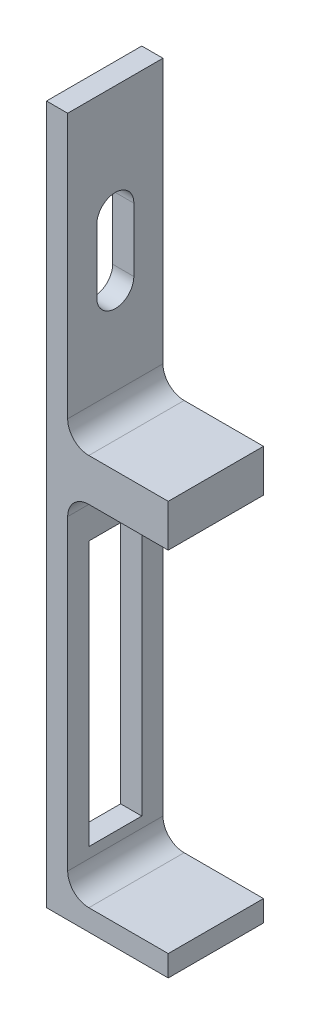
ISO-10303-21;
HEADER;
FILE_DESCRIPTION(('STEP AP214'),'2;1');
FILE_NAME('part.step','',(''),(''),'','','');
FILE_SCHEMA(('AUTOMOTIVE_DESIGN { 1 0 10303 214 1 1 1 1 }'));
ENDSEC;
DATA;
#1=APPLICATION_CONTEXT('core data for automotive mechanical design processes');
#2=APPLICATION_PROTOCOL_DEFINITION('international standard','automotive_design',2000,#1);
#3=PRODUCT_CONTEXT('',#1,'mechanical');
#4=PRODUCT('Part','Part','',(#3));
#5=PRODUCT_RELATED_PRODUCT_CATEGORY('part','',(#4));
#6=PRODUCT_DEFINITION_FORMATION('','',#4);
#7=PRODUCT_DEFINITION_CONTEXT('part definition',#1,'design');
#8=PRODUCT_DEFINITION('design','',#6,#7);
#9=PRODUCT_DEFINITION_SHAPE('','',#8);
#10=(LENGTH_UNIT() NAMED_UNIT(*) SI_UNIT(.MILLI.,.METRE.));
#11=(NAMED_UNIT(*) PLANE_ANGLE_UNIT() SI_UNIT($,.RADIAN.));
#12=(NAMED_UNIT(*) SI_UNIT($,.STERADIAN.) SOLID_ANGLE_UNIT());
#13=UNCERTAINTY_MEASURE_WITH_UNIT(LENGTH_MEASURE(1.E-05),#10,'distance_accuracy_value','');
#14=(GEOMETRIC_REPRESENTATION_CONTEXT(3) GLOBAL_UNCERTAINTY_ASSIGNED_CONTEXT((#13)) GLOBAL_UNIT_ASSIGNED_CONTEXT((#10,
#11,#12)) REPRESENTATION_CONTEXT('',''));
#15=CARTESIAN_POINT('',(0.,0.,0.));
#16=DIRECTION('',(0.,0.,1.));
#17=DIRECTION('',(1.,0.,0.));
#18=AXIS2_PLACEMENT_3D('',#15,#16,#17);
#19=CARTESIAN_POINT('',(2.,2.,9.));
#20=DIRECTION('',(-1.,0.,0.));
#21=DIRECTION('',(0.,0.,1.));
#22=AXIS2_PLACEMENT_3D('',#19,#20,#21);
#23=PLANE('',#22);
#24=DIRECTION('',(0.,1.,0.));
#25=VECTOR('',#24,1.);
#26=CARTESIAN_POINT('',(2.,2.,6.25000000000002));
#27=LINE('',#26,#25);
#28=CARTESIAN_POINT('',(2.,49.52,6.25000000000001));
#29=VERTEX_POINT('',#28);
#30=CARTESIAN_POINT('',(2.,55.52,6.25000000000001));
#31=VERTEX_POINT('',#30);
#32=EDGE_CURVE('E304',#29,#31,#27,.T.);
#33=ORIENTED_EDGE('',*,*,#32,.T.);
#34=CARTESIAN_POINT('',(2.,55.52,4.5));
#35=DIRECTION('',(-1.,0.,0.));
#36=DIRECTION('',(0.,0.,1.));
#37=AXIS2_PLACEMENT_3D('',#34,#35,#36);
#38=CIRCLE('',#37,1.75);
#39=CARTESIAN_POINT('',(2.,55.52,2.75));
#40=VERTEX_POINT('',#39);
#41=EDGE_CURVE('E307',#31,#40,#38,.T.);
#42=ORIENTED_EDGE('',*,*,#41,.T.);
#43=DIRECTION('',(0.,-1.,0.));
#44=VECTOR('',#43,1.);
#45=CARTESIAN_POINT('',(2.,2.,2.75000000000002));
#46=LINE('',#45,#44);
#47=CARTESIAN_POINT('',(2.,49.52,2.75));
#48=VERTEX_POINT('',#47);
#49=EDGE_CURVE('E298',#40,#48,#46,.T.);
#50=ORIENTED_EDGE('',*,*,#49,.T.);
#51=CARTESIAN_POINT('',(2.,49.52,4.50000000000001));
#52=DIRECTION('',(-1.,0.,0.));
#53=DIRECTION('',(0.,0.,1.));
#54=AXIS2_PLACEMENT_3D('',#51,#52,#53);
#55=CIRCLE('',#54,1.75);
#56=EDGE_CURVE('E301',#48,#29,#55,.T.);
#57=ORIENTED_EDGE('',*,*,#56,.T.);
#58=EDGE_LOOP('',(#33,#42,#50,#57));
#59=FACE_BOUND('',#58,.T.);
#60=DIRECTION('',(0.,1.,0.));
#61=VECTOR('',#60,1.);
#62=CARTESIAN_POINT('',(2.,2.,9.));
#63=LINE('',#62,#61);
#64=CARTESIAN_POINT('',(2.,41.,9.));
#65=VERTEX_POINT('',#64);
#66=CARTESIAN_POINT('',(2.,66.,9.));
#67=VERTEX_POINT('',#66);
#68=EDGE_CURVE('E264',#65,#67,#63,.T.);
#69=ORIENTED_EDGE('',*,*,#68,.F.);
#70=DIRECTION('',(0.,0.,1.));
#71=VECTOR('',#70,1.);
#72=CARTESIAN_POINT('',(2.,41.,9.));
#73=LINE('',#72,#71);
#74=CARTESIAN_POINT('',(2.,41.,0.));
#75=VERTEX_POINT('',#74);
#76=EDGE_CURVE('E322',#65,#75,#73,.F.);
#77=ORIENTED_EDGE('',*,*,#76,.T.);
#78=DIRECTION('',(0.,1.,0.));
#79=VECTOR('',#78,1.);
#80=CARTESIAN_POINT('',(2.,2.,0.));
#81=LINE('',#80,#79);
#82=CARTESIAN_POINT('',(2.,66.,0.));
#83=VERTEX_POINT('',#82);
#84=EDGE_CURVE('E279',#75,#83,#81,.T.);
#85=ORIENTED_EDGE('',*,*,#84,.T.);
#86=DIRECTION('',(0.,0.,-1.));
#87=VECTOR('',#86,1.);
#88=CARTESIAN_POINT('',(2.,66.,9.));
#89=LINE('',#88,#87);
#90=EDGE_CURVE('E286',#67,#83,#89,.T.);
#91=ORIENTED_EDGE('',*,*,#90,.F.);
#92=EDGE_LOOP('',(#69,#77,#85,#91));
#93=FACE_BOUND('',#92,.T.);
#94=ADVANCED_FACE('F36',(#59,#93),#23,.F.);
#95=CARTESIAN_POINT('',(0.,66.,9.));
#96=DIRECTION('',(1.,0.,0.));
#97=DIRECTION('',(0.,1.,0.));
#98=AXIS2_PLACEMENT_3D('',#95,#96,#97);
#99=PLANE('',#98);
#100=DIRECTION('',(0.,0.,1.));
#101=VECTOR('',#100,1.);
#102=CARTESIAN_POINT('',(0.,30.,7.));
#103=LINE('',#102,#101);
#104=CARTESIAN_POINT('',(0.,30.,2.00000000000001));
#105=VERTEX_POINT('',#104);
#106=CARTESIAN_POINT('',(0.,30.,7.));
#107=VERTEX_POINT('',#106);
#108=EDGE_CURVE('E210',#105,#107,#103,.T.);
#109=ORIENTED_EDGE('',*,*,#108,.T.);
#110=DIRECTION('',(0.,-1.,0.));
#111=VECTOR('',#110,1.);
#112=CARTESIAN_POINT('',(0.,5.,7.));
#113=LINE('',#112,#111);
#114=CARTESIAN_POINT('',(0.,5.,7.));
#115=VERTEX_POINT('',#114);
#116=EDGE_CURVE('E200',#107,#115,#113,.T.);
#117=ORIENTED_EDGE('',*,*,#116,.T.);
#118=DIRECTION('',(0.,0.,-1.));
#119=VECTOR('',#118,1.);
#120=CARTESIAN_POINT('',(0.,5.,7.));
#121=LINE('',#120,#119);
#122=CARTESIAN_POINT('',(0.,5.,2.00000000000001));
#123=VERTEX_POINT('',#122);
#124=EDGE_CURVE('E203',#115,#123,#121,.T.);
#125=ORIENTED_EDGE('',*,*,#124,.T.);
#126=DIRECTION('',(0.,1.,0.));
#127=VECTOR('',#126,1.);
#128=CARTESIAN_POINT('',(0.,5.,2.00000000000001));
#129=LINE('',#128,#127);
#130=EDGE_CURVE('E207',#123,#105,#129,.T.);
#131=ORIENTED_EDGE('',*,*,#130,.T.);
#132=EDGE_LOOP('',(#109,#117,#125,#131));
#133=FACE_BOUND('',#132,.T.);
#134=DIRECTION('',(0.,-1.,0.));
#135=VECTOR('',#134,1.);
#136=CARTESIAN_POINT('',(0.,55.52,2.75));
#137=LINE('',#136,#135);
#138=CARTESIAN_POINT('',(0.,55.52,2.75));
#139=VERTEX_POINT('',#138);
#140=CARTESIAN_POINT('',(0.,49.52,2.75));
#141=VERTEX_POINT('',#140);
#142=EDGE_CURVE('E235',#139,#141,#137,.T.);
#143=ORIENTED_EDGE('',*,*,#142,.F.);
#144=CARTESIAN_POINT('',(0.,55.52,4.5));
#145=DIRECTION('',(-1.,0.,0.));
#146=DIRECTION('',(0.,-1.,0.));
#147=AXIS2_PLACEMENT_3D('',#144,#145,#146);
#148=CIRCLE('',#147,1.75);
#149=CARTESIAN_POINT('',(0.,55.52,6.25000000000001));
#150=VERTEX_POINT('',#149);
#151=EDGE_CURVE('E227',#150,#139,#148,.T.);
#152=ORIENTED_EDGE('',*,*,#151,.F.);
#153=DIRECTION('',(0.,1.,0.));
#154=VECTOR('',#153,1.);
#155=CARTESIAN_POINT('',(0.,55.52,6.25000000000001));
#156=LINE('',#155,#154);
#157=CARTESIAN_POINT('',(0.,49.52,6.25000000000001));
#158=VERTEX_POINT('',#157);
#159=EDGE_CURVE('E241',#158,#150,#156,.T.);
#160=ORIENTED_EDGE('',*,*,#159,.F.);
#161=CARTESIAN_POINT('',(0.,49.52,4.50000000000001));
#162=DIRECTION('',(-1.,0.,0.));
#163=DIRECTION('',(0.,-1.,0.));
#164=AXIS2_PLACEMENT_3D('',#161,#162,#163);
#165=CIRCLE('',#164,1.75);
#166=EDGE_CURVE('E238',#141,#158,#165,.T.);
#167=ORIENTED_EDGE('',*,*,#166,.F.);
#168=EDGE_LOOP('',(#143,#152,#160,#167));
#169=FACE_BOUND('',#168,.T.);
#170=DIRECTION('',(0.,-1.,0.));
#171=VECTOR('',#170,1.);
#172=CARTESIAN_POINT('',(0.,66.,0.));
#173=LINE('',#172,#171);
#174=CARTESIAN_POINT('',(0.,66.,0.));
#175=VERTEX_POINT('',#174);
#176=CARTESIAN_POINT('',(0.,0.,0.));
#177=VERTEX_POINT('',#176);
#178=EDGE_CURVE('E247',#175,#177,#173,.T.);
#179=ORIENTED_EDGE('',*,*,#178,.T.);
#180=DIRECTION('',(0.,0.,-1.));
#181=VECTOR('',#180,1.);
#182=CARTESIAN_POINT('',(0.,0.,9.));
#183=LINE('',#182,#181);
#184=CARTESIAN_POINT('',(0.,0.,9.));
#185=VERTEX_POINT('',#184);
#186=EDGE_CURVE('E295',#185,#177,#183,.T.);
#187=ORIENTED_EDGE('',*,*,#186,.F.);
#188=DIRECTION('',(0.,-1.,0.));
#189=VECTOR('',#188,1.);
#190=CARTESIAN_POINT('',(0.,66.,9.));
#191=LINE('',#190,#189);
#192=CARTESIAN_POINT('',(0.,66.,9.));
#193=VERTEX_POINT('',#192);
#194=EDGE_CURVE('E254',#193,#185,#191,.T.);
#195=ORIENTED_EDGE('',*,*,#194,.F.);
#196=DIRECTION('',(0.,0.,-1.));
#197=VECTOR('',#196,1.);
#198=CARTESIAN_POINT('',(0.,66.,9.));
#199=LINE('',#198,#197);
#200=EDGE_CURVE('E269',#193,#175,#199,.T.);
#201=ORIENTED_EDGE('',*,*,#200,.T.);
#202=EDGE_LOOP('',(#179,#187,#195,#201));
#203=FACE_BOUND('',#202,.T.);
#204=ADVANCED_FACE('F357',(#133,#169,#203),#99,.F.);
#205=CARTESIAN_POINT('',(0.,0.,9.));
#206=DIRECTION('',(0.,1.,0.));
#207=DIRECTION('',(0.,0.,1.));
#208=AXIS2_PLACEMENT_3D('',#205,#206,#207);
#209=PLANE('',#208);
#210=DIRECTION('',(1.,0.,0.));
#211=VECTOR('',#210,1.);
#212=CARTESIAN_POINT('',(0.,0.,0.));
#213=LINE('',#212,#211);
#214=CARTESIAN_POINT('',(11.5,0.,0.));
#215=VERTEX_POINT('',#214);
#216=EDGE_CURVE('E272',#177,#215,#213,.T.);
#217=ORIENTED_EDGE('',*,*,#216,.T.);
#218=DIRECTION('',(0.,0.,-1.));
#219=VECTOR('',#218,1.);
#220=CARTESIAN_POINT('',(11.5,0.,9.));
#221=LINE('',#220,#219);
#222=CARTESIAN_POINT('',(11.5,0.,9.));
#223=VERTEX_POINT('',#222);
#224=EDGE_CURVE('E292',#223,#215,#221,.T.);
#225=ORIENTED_EDGE('',*,*,#224,.F.);
#226=DIRECTION('',(1.,0.,0.));
#227=VECTOR('',#226,1.);
#228=CARTESIAN_POINT('',(0.,0.,9.));
#229=LINE('',#228,#227);
#230=EDGE_CURVE('E256',#185,#223,#229,.T.);
#231=ORIENTED_EDGE('',*,*,#230,.F.);
#232=ORIENTED_EDGE('',*,*,#186,.T.);
#233=EDGE_LOOP('',(#217,#225,#231,#232));
#234=FACE_BOUND('',#233,.T.);
#235=ADVANCED_FACE('F359',(#234),#209,.F.);
#236=CARTESIAN_POINT('',(11.5,0.,9.));
#237=DIRECTION('',(-1.,0.,0.));
#238=DIRECTION('',(0.,0.,1.));
#239=AXIS2_PLACEMENT_3D('',#236,#237,#238);
#240=PLANE('',#239);
#241=DIRECTION('',(0.,1.,0.));
#242=VECTOR('',#241,1.);
#243=CARTESIAN_POINT('',(11.5,0.,0.));
#244=LINE('',#243,#242);
#245=CARTESIAN_POINT('',(11.5,2.,0.));
#246=VERTEX_POINT('',#245);
#247=EDGE_CURVE('E274',#215,#246,#244,.T.);
#248=ORIENTED_EDGE('',*,*,#247,.T.);
#249=DIRECTION('',(0.,0.,-1.));
#250=VECTOR('',#249,1.);
#251=CARTESIAN_POINT('',(11.5,2.,9.));
#252=LINE('',#251,#250);
#253=CARTESIAN_POINT('',(11.5,2.,9.));
#254=VERTEX_POINT('',#253);
#255=EDGE_CURVE('E289',#254,#246,#252,.T.);
#256=ORIENTED_EDGE('',*,*,#255,.F.);
#257=DIRECTION('',(0.,1.,0.));
#258=VECTOR('',#257,1.);
#259=CARTESIAN_POINT('',(11.5,0.,9.));
#260=LINE('',#259,#258);
#261=EDGE_CURVE('E259',#223,#254,#260,.T.);
#262=ORIENTED_EDGE('',*,*,#261,.F.);
#263=ORIENTED_EDGE('',*,*,#224,.T.);
#264=EDGE_LOOP('',(#248,#256,#262,#263));
#265=FACE_BOUND('',#264,.T.);
#266=ADVANCED_FACE('F364',(#265),#240,.F.);
#267=CARTESIAN_POINT('',(11.5,2.,9.));
#268=DIRECTION('',(0.,-1.,0.));
#269=DIRECTION('',(1.,0.,0.));
#270=AXIS2_PLACEMENT_3D('',#267,#268,#269);
#271=PLANE('',#270);
#272=DIRECTION('',(-1.,0.,0.));
#273=VECTOR('',#272,1.);
#274=CARTESIAN_POINT('',(11.5,2.,0.));
#275=LINE('',#274,#273);
#276=CARTESIAN_POINT('',(4.,2.,0.));
#277=VERTEX_POINT('',#276);
#278=EDGE_CURVE('E276',#246,#277,#275,.T.);
#279=ORIENTED_EDGE('',*,*,#278,.T.);
#280=DIRECTION('',(0.,0.,-1.));
#281=VECTOR('',#280,1.);
#282=CARTESIAN_POINT('',(4.,2.,9.));
#283=LINE('',#282,#281);
#284=CARTESIAN_POINT('',(4.,2.,9.));
#285=VERTEX_POINT('',#284);
#286=EDGE_CURVE('E313',#277,#285,#283,.F.);
#287=ORIENTED_EDGE('',*,*,#286,.T.);
#288=DIRECTION('',(-1.,0.,0.));
#289=VECTOR('',#288,1.);
#290=CARTESIAN_POINT('',(11.5,2.,9.));
#291=LINE('',#290,#289);
#292=EDGE_CURVE('E261',#254,#285,#291,.T.);
#293=ORIENTED_EDGE('',*,*,#292,.F.);
#294=ORIENTED_EDGE('',*,*,#255,.T.);
#295=EDGE_LOOP('',(#279,#287,#293,#294));
#296=FACE_BOUND('',#295,.T.);
#297=ADVANCED_FACE('F395',(#296),#271,.F.);
#298=DIRECTION('',(0.,0.,-1.));
#299=VECTOR('',#298,1.);
#300=CARTESIAN_POINT('',(2.,5.,7.));
#301=LINE('',#300,#299);
#302=CARTESIAN_POINT('',(2.,5.,7.));
#303=VERTEX_POINT('',#302);
#304=CARTESIAN_POINT('',(2.,5.,2.00000000000001));
#305=VERTEX_POINT('',#304);
#306=EDGE_CURVE('E216',#303,#305,#301,.T.);
#307=ORIENTED_EDGE('',*,*,#306,.F.);
#308=DIRECTION('',(0.,-1.,0.));
#309=VECTOR('',#308,1.);
#310=CARTESIAN_POINT('',(2.,5.,7.));
#311=LINE('',#310,#309);
#312=CARTESIAN_POINT('',(2.,30.,7.));
#313=VERTEX_POINT('',#312);
#314=EDGE_CURVE('E214',#313,#303,#311,.T.);
#315=ORIENTED_EDGE('',*,*,#314,.F.);
#316=DIRECTION('',(0.,0.,1.));
#317=VECTOR('',#316,1.);
#318=CARTESIAN_POINT('',(2.,30.,7.));
#319=LINE('',#318,#317);
#320=CARTESIAN_POINT('',(2.,30.,2.00000000000001));
#321=VERTEX_POINT('',#320);
#322=EDGE_CURVE('E204',#321,#313,#319,.T.);
#323=ORIENTED_EDGE('',*,*,#322,.F.);
#324=DIRECTION('',(0.,1.,0.));
#325=VECTOR('',#324,1.);
#326=CARTESIAN_POINT('',(2.,5.,2.00000000000001));
#327=LINE('',#326,#325);
#328=EDGE_CURVE('E220',#305,#321,#327,.T.);
#329=ORIENTED_EDGE('',*,*,#328,.F.);
#330=EDGE_LOOP('',(#307,#315,#323,#329));
#331=FACE_BOUND('',#330,.T.);
#332=CARTESIAN_POINT('',(2.,4.,0.));
#333=VERTEX_POINT('',#332);
#334=CARTESIAN_POINT('',(2.,33.,0.));
#335=VERTEX_POINT('',#334);
#336=EDGE_CURVE('E280',#333,#335,#81,.T.);
#337=ORIENTED_EDGE('',*,*,#336,.T.);
#338=DIRECTION('',(0.,0.,1.));
#339=VECTOR('',#338,1.);
#340=CARTESIAN_POINT('',(2.,33.,9.));
#341=LINE('',#340,#339);
#342=CARTESIAN_POINT('',(2.,33.,9.));
#343=VERTEX_POINT('',#342);
#344=EDGE_CURVE('E324',#335,#343,#341,.T.);
#345=ORIENTED_EDGE('',*,*,#344,.T.);
#346=CARTESIAN_POINT('',(2.,4.,9.));
#347=VERTEX_POINT('',#346);
#348=EDGE_CURVE('E265',#347,#343,#63,.T.);
#349=ORIENTED_EDGE('',*,*,#348,.F.);
#350=DIRECTION('',(0.,0.,-1.));
#351=VECTOR('',#350,1.);
#352=CARTESIAN_POINT('',(2.,4.,0.));
#353=LINE('',#352,#351);
#354=EDGE_CURVE('E310',#347,#333,#353,.T.);
#355=ORIENTED_EDGE('',*,*,#354,.T.);
#356=EDGE_LOOP('',(#337,#345,#349,#355));
#357=FACE_BOUND('',#356,.T.);
#358=ADVANCED_FACE('F375',(#331,#357),#23,.F.);
#359=CARTESIAN_POINT('',(2.,66.,9.));
#360=DIRECTION('',(0.,-1.,0.));
#361=DIRECTION('',(0.,0.,-1.));
#362=AXIS2_PLACEMENT_3D('',#359,#360,#361);
#363=PLANE('',#362);
#364=DIRECTION('',(-1.,0.,0.));
#365=VECTOR('',#364,1.);
#366=CARTESIAN_POINT('',(2.,66.,0.));
#367=LINE('',#366,#365);
#368=EDGE_CURVE('E257',#83,#175,#367,.T.);
#369=ORIENTED_EDGE('',*,*,#368,.T.);
#370=ORIENTED_EDGE('',*,*,#200,.F.);
#371=DIRECTION('',(-1.,0.,0.));
#372=VECTOR('',#371,1.);
#373=CARTESIAN_POINT('',(2.,66.,9.));
#374=LINE('',#373,#372);
#375=EDGE_CURVE('E267',#67,#193,#374,.T.);
#376=ORIENTED_EDGE('',*,*,#375,.F.);
#377=ORIENTED_EDGE('',*,*,#90,.T.);
#378=EDGE_LOOP('',(#369,#370,#376,#377));
#379=FACE_BOUND('',#378,.T.);
#380=ADVANCED_FACE('F352',(#379),#363,.F.);
#381=CARTESIAN_POINT('',(0.,0.,9.));
#382=DIRECTION('',(0.,0.,1.));
#383=DIRECTION('',(1.,0.,0.));
#384=AXIS2_PLACEMENT_3D('',#381,#382,#383);
#385=PLANE('',#384);
#386=ORIENTED_EDGE('',*,*,#194,.T.);
#387=ORIENTED_EDGE('',*,*,#230,.T.);
#388=ORIENTED_EDGE('',*,*,#261,.T.);
#389=ORIENTED_EDGE('',*,*,#292,.T.);
#390=CARTESIAN_POINT('',(4.,4.,9.));
#391=DIRECTION('',(0.,0.,1.));
#392=DIRECTION('',(1.,0.,0.));
#393=AXIS2_PLACEMENT_3D('',#390,#391,#392);
#394=CIRCLE('',#393,2.);
#395=EDGE_CURVE('E317',#285,#347,#394,.F.);
#396=ORIENTED_EDGE('',*,*,#395,.T.);
#397=ORIENTED_EDGE('',*,*,#348,.T.);
#398=CARTESIAN_POINT('',(4.,33.,9.));
#399=DIRECTION('',(0.,0.,1.));
#400=DIRECTION('',(1.,0.,0.));
#401=AXIS2_PLACEMENT_3D('',#398,#399,#400);
#402=CIRCLE('',#401,2.);
#403=CARTESIAN_POINT('',(4.,35.,9.));
#404=VERTEX_POINT('',#403);
#405=EDGE_CURVE('E44',#343,#404,#402,.F.);
#406=ORIENTED_EDGE('',*,*,#405,.T.);
#407=DIRECTION('',(1.,0.,0.));
#408=VECTOR('',#407,1.);
#409=CARTESIAN_POINT('',(2.,35.,9.));
#410=LINE('',#409,#408);
#411=CARTESIAN_POINT('',(11.5,35.,9.));
#412=VERTEX_POINT('',#411);
#413=EDGE_CURVE('E176',#404,#412,#410,.T.);
#414=ORIENTED_EDGE('',*,*,#413,.T.);
#415=DIRECTION('',(0.,1.,0.));
#416=VECTOR('',#415,1.);
#417=CARTESIAN_POINT('',(11.5,39.,9.));
#418=LINE('',#417,#416);
#419=CARTESIAN_POINT('',(11.5,39.,9.));
#420=VERTEX_POINT('',#419);
#421=EDGE_CURVE('E182',#412,#420,#418,.T.);
#422=ORIENTED_EDGE('',*,*,#421,.T.);
#423=DIRECTION('',(-1.,0.,0.));
#424=VECTOR('',#423,1.);
#425=CARTESIAN_POINT('',(2.,39.,9.));
#426=LINE('',#425,#424);
#427=CARTESIAN_POINT('',(4.,39.,9.));
#428=VERTEX_POINT('',#427);
#429=EDGE_CURVE('E183',#420,#428,#426,.T.);
#430=ORIENTED_EDGE('',*,*,#429,.T.);
#431=CARTESIAN_POINT('',(4.,41.,9.));
#432=DIRECTION('',(0.,0.,1.));
#433=DIRECTION('',(1.,0.,0.));
#434=AXIS2_PLACEMENT_3D('',#431,#432,#433);
#435=CIRCLE('',#434,2.);
#436=EDGE_CURVE('E328',#428,#65,#435,.F.);
#437=ORIENTED_EDGE('',*,*,#436,.T.);
#438=ORIENTED_EDGE('',*,*,#68,.T.);
#439=ORIENTED_EDGE('',*,*,#375,.T.);
#440=EDGE_LOOP('',(#386,#387,#388,#389,#396,#397,#406,#414,#422,#430,#437,#438,#439));
#441=FACE_BOUND('',#440,.T.);
#442=ADVANCED_FACE('F179',(#441),#385,.T.);
#443=CARTESIAN_POINT('',(0.,0.,0.));
#444=DIRECTION('',(0.,0.,1.));
#445=DIRECTION('',(1.,0.,0.));
#446=AXIS2_PLACEMENT_3D('',#443,#444,#445);
#447=PLANE('',#446);
#448=ORIENTED_EDGE('',*,*,#178,.F.);
#449=ORIENTED_EDGE('',*,*,#368,.F.);
#450=ORIENTED_EDGE('',*,*,#84,.F.);
#451=CARTESIAN_POINT('',(4.,41.,0.));
#452=DIRECTION('',(0.,0.,1.));
#453=DIRECTION('',(1.,0.,0.));
#454=AXIS2_PLACEMENT_3D('',#451,#452,#453);
#455=CIRCLE('',#454,2.);
#456=CARTESIAN_POINT('',(4.,39.,0.));
#457=VERTEX_POINT('',#456);
#458=EDGE_CURVE('E330',#75,#457,#455,.T.);
#459=ORIENTED_EDGE('',*,*,#458,.T.);
#460=DIRECTION('',(1.,0.,0.));
#461=VECTOR('',#460,1.);
#462=CARTESIAN_POINT('',(2.,39.,0.));
#463=LINE('',#462,#461);
#464=CARTESIAN_POINT('',(11.5,39.,0.));
#465=VERTEX_POINT('',#464);
#466=EDGE_CURVE('E217',#457,#465,#463,.T.);
#467=ORIENTED_EDGE('',*,*,#466,.T.);
#468=DIRECTION('',(0.,-1.,0.));
#469=VECTOR('',#468,1.);
#470=CARTESIAN_POINT('',(11.5,39.,0.));
#471=LINE('',#470,#469);
#472=CARTESIAN_POINT('',(11.5,35.,0.));
#473=VERTEX_POINT('',#472);
#474=EDGE_CURVE('E343',#465,#473,#471,.T.);
#475=ORIENTED_EDGE('',*,*,#474,.T.);
#476=DIRECTION('',(-1.,0.,0.));
#477=VECTOR('',#476,1.);
#478=CARTESIAN_POINT('',(2.,35.,0.));
#479=LINE('',#478,#477);
#480=CARTESIAN_POINT('',(4.,35.,0.));
#481=VERTEX_POINT('',#480);
#482=EDGE_CURVE('E188',#473,#481,#479,.T.);
#483=ORIENTED_EDGE('',*,*,#482,.T.);
#484=CARTESIAN_POINT('',(4.,33.,0.));
#485=DIRECTION('',(0.,0.,1.));
#486=DIRECTION('',(1.,0.,0.));
#487=AXIS2_PLACEMENT_3D('',#484,#485,#486);
#488=CIRCLE('',#487,2.);
#489=EDGE_CURVE('E11',#481,#335,#488,.T.);
#490=ORIENTED_EDGE('',*,*,#489,.T.);
#491=ORIENTED_EDGE('',*,*,#336,.F.);
#492=CARTESIAN_POINT('',(4.,4.,0.));
#493=DIRECTION('',(0.,0.,1.));
#494=DIRECTION('',(1.,0.,0.));
#495=AXIS2_PLACEMENT_3D('',#492,#493,#494);
#496=CIRCLE('',#495,2.);
#497=EDGE_CURVE('E315',#333,#277,#496,.T.);
#498=ORIENTED_EDGE('',*,*,#497,.T.);
#499=ORIENTED_EDGE('',*,*,#278,.F.);
#500=ORIENTED_EDGE('',*,*,#247,.F.);
#501=ORIENTED_EDGE('',*,*,#216,.F.);
#502=EDGE_LOOP('',(#448,#449,#450,#459,#467,#475,#483,#490,#491,#498,#499,#500,#501));
#503=FACE_BOUND('',#502,.T.);
#504=ADVANCED_FACE('F336',(#503),#447,.F.);
#505=CARTESIAN_POINT('',(11.5,55.52,4.5));
#506=DIRECTION('',(-1.,0.,0.));
#507=DIRECTION('',(0.,-1.,0.));
#508=AXIS2_PLACEMENT_3D('',#505,#506,#507);
#509=CYLINDRICAL_SURFACE('',#508,1.75);
#510=DIRECTION('',(-1.,0.,0.));
#511=VECTOR('',#510,1.);
#512=CARTESIAN_POINT('',(11.5,55.52,6.25000000000001));
#513=LINE('',#512,#511);
#514=EDGE_CURVE('E245',#31,#150,#513,.T.);
#515=ORIENTED_EDGE('',*,*,#514,.T.);
#516=ORIENTED_EDGE('',*,*,#151,.T.);
#517=DIRECTION('',(-1.,0.,0.));
#518=VECTOR('',#517,1.);
#519=CARTESIAN_POINT('',(11.5,55.52,2.75));
#520=LINE('',#519,#518);
#521=EDGE_CURVE('E244',#40,#139,#520,.T.);
#522=ORIENTED_EDGE('',*,*,#521,.F.);
#523=ORIENTED_EDGE('',*,*,#41,.F.);
#524=EDGE_LOOP('',(#515,#516,#522,#523));
#525=FACE_BOUND('',#524,.T.);
#526=ADVANCED_FACE('F427',(#525),#509,.F.);
#527=CARTESIAN_POINT('',(11.5,55.52,6.25000000000001));
#528=DIRECTION('',(0.,0.,1.));
#529=DIRECTION('',(0.,-1.,0.));
#530=AXIS2_PLACEMENT_3D('',#527,#528,#529);
#531=PLANE('',#530);
#532=DIRECTION('',(-1.,0.,0.));
#533=VECTOR('',#532,1.);
#534=CARTESIAN_POINT('',(11.5,49.52,6.25000000000001));
#535=LINE('',#534,#533);
#536=EDGE_CURVE('E248',#29,#158,#535,.T.);
#537=ORIENTED_EDGE('',*,*,#536,.T.);
#538=ORIENTED_EDGE('',*,*,#159,.T.);
#539=ORIENTED_EDGE('',*,*,#514,.F.);
#540=ORIENTED_EDGE('',*,*,#32,.F.);
#541=EDGE_LOOP('',(#537,#538,#539,#540));
#542=FACE_BOUND('',#541,.T.);
#543=ADVANCED_FACE('F431',(#542),#531,.F.);
#544=CARTESIAN_POINT('',(11.5,49.52,4.50000000000001));
#545=DIRECTION('',(-1.,0.,0.));
#546=DIRECTION('',(0.,-1.,0.));
#547=AXIS2_PLACEMENT_3D('',#544,#545,#546);
#548=CYLINDRICAL_SURFACE('',#547,1.75);
#549=DIRECTION('',(-1.,0.,0.));
#550=VECTOR('',#549,1.);
#551=CARTESIAN_POINT('',(11.5,49.52,2.75));
#552=LINE('',#551,#550);
#553=EDGE_CURVE('E250',#48,#141,#552,.T.);
#554=ORIENTED_EDGE('',*,*,#553,.T.);
#555=ORIENTED_EDGE('',*,*,#166,.T.);
#556=ORIENTED_EDGE('',*,*,#536,.F.);
#557=ORIENTED_EDGE('',*,*,#56,.F.);
#558=EDGE_LOOP('',(#554,#555,#556,#557));
#559=FACE_BOUND('',#558,.T.);
#560=ADVANCED_FACE('F433',(#559),#548,.F.);
#561=CARTESIAN_POINT('',(11.5,55.52,2.75));
#562=DIRECTION('',(0.,0.,-1.));
#563=DIRECTION('',(0.,1.,0.));
#564=AXIS2_PLACEMENT_3D('',#561,#562,#563);
#565=PLANE('',#564);
#566=ORIENTED_EDGE('',*,*,#521,.T.);
#567=ORIENTED_EDGE('',*,*,#142,.T.);
#568=ORIENTED_EDGE('',*,*,#553,.F.);
#569=ORIENTED_EDGE('',*,*,#49,.F.);
#570=EDGE_LOOP('',(#566,#567,#568,#569));
#571=FACE_BOUND('',#570,.T.);
#572=ADVANCED_FACE('F423',(#571),#565,.F.);
#573=CARTESIAN_POINT('',(0.,5.,7.));
#574=DIRECTION('',(0.,0.,1.));
#575=DIRECTION('',(0.,-1.,0.));
#576=AXIS2_PLACEMENT_3D('',#573,#574,#575);
#577=PLANE('',#576);
#578=ORIENTED_EDGE('',*,*,#314,.T.);
#579=DIRECTION('',(1.,0.,0.));
#580=VECTOR('',#579,1.);
#581=CARTESIAN_POINT('',(0.,5.,7.));
#582=LINE('',#581,#580);
#583=EDGE_CURVE('E213',#115,#303,#582,.T.);
#584=ORIENTED_EDGE('',*,*,#583,.F.);
#585=ORIENTED_EDGE('',*,*,#116,.F.);
#586=DIRECTION('',(1.,0.,0.));
#587=VECTOR('',#586,1.);
#588=CARTESIAN_POINT('',(0.,30.,7.));
#589=LINE('',#588,#587);
#590=EDGE_CURVE('E225',#107,#313,#589,.T.);
#591=ORIENTED_EDGE('',*,*,#590,.T.);
#592=EDGE_LOOP('',(#578,#584,#585,#591));
#593=FACE_BOUND('',#592,.T.);
#594=ADVANCED_FACE('F411',(#593),#577,.F.);
#595=CARTESIAN_POINT('',(0.,30.,7.));
#596=DIRECTION('',(0.,1.,0.));
#597=DIRECTION('',(0.,0.,1.));
#598=AXIS2_PLACEMENT_3D('',#595,#596,#597);
#599=PLANE('',#598);
#600=ORIENTED_EDGE('',*,*,#322,.T.);
#601=ORIENTED_EDGE('',*,*,#590,.F.);
#602=ORIENTED_EDGE('',*,*,#108,.F.);
#603=DIRECTION('',(1.,0.,0.));
#604=VECTOR('',#603,1.);
#605=CARTESIAN_POINT('',(0.,30.,2.00000000000001));
#606=LINE('',#605,#604);
#607=EDGE_CURVE('E228',#105,#321,#606,.T.);
#608=ORIENTED_EDGE('',*,*,#607,.T.);
#609=EDGE_LOOP('',(#600,#601,#602,#608));
#610=FACE_BOUND('',#609,.T.);
#611=ADVANCED_FACE('F414',(#610),#599,.F.);
#612=CARTESIAN_POINT('',(0.,5.,2.00000000000001));
#613=DIRECTION('',(0.,0.,-1.));
#614=DIRECTION('',(0.,1.,0.));
#615=AXIS2_PLACEMENT_3D('',#612,#613,#614);
#616=PLANE('',#615);
#617=ORIENTED_EDGE('',*,*,#328,.T.);
#618=ORIENTED_EDGE('',*,*,#607,.F.);
#619=ORIENTED_EDGE('',*,*,#130,.F.);
#620=DIRECTION('',(1.,0.,0.));
#621=VECTOR('',#620,1.);
#622=CARTESIAN_POINT('',(0.,5.,2.00000000000001));
#623=LINE('',#622,#621);
#624=EDGE_CURVE('E230',#123,#305,#623,.T.);
#625=ORIENTED_EDGE('',*,*,#624,.T.);
#626=EDGE_LOOP('',(#617,#618,#619,#625));
#627=FACE_BOUND('',#626,.T.);
#628=ADVANCED_FACE('F416',(#627),#616,.F.);
#629=CARTESIAN_POINT('',(0.,5.,7.));
#630=DIRECTION('',(0.,-1.,0.));
#631=DIRECTION('',(0.,0.,-1.));
#632=AXIS2_PLACEMENT_3D('',#629,#630,#631);
#633=PLANE('',#632);
#634=ORIENTED_EDGE('',*,*,#306,.T.);
#635=ORIENTED_EDGE('',*,*,#624,.F.);
#636=ORIENTED_EDGE('',*,*,#124,.F.);
#637=ORIENTED_EDGE('',*,*,#583,.T.);
#638=EDGE_LOOP('',(#634,#635,#636,#637));
#639=FACE_BOUND('',#638,.T.);
#640=ADVANCED_FACE('F407',(#639),#633,.F.);
#641=CARTESIAN_POINT('',(4.,4.,9.));
#642=DIRECTION('',(0.,0.,1.));
#643=DIRECTION('',(1.,0.,0.));
#644=AXIS2_PLACEMENT_3D('',#641,#642,#643);
#645=CYLINDRICAL_SURFACE('',#644,2.);
#646=ORIENTED_EDGE('',*,*,#395,.F.);
#647=ORIENTED_EDGE('',*,*,#286,.F.);
#648=ORIENTED_EDGE('',*,*,#497,.F.);
#649=ORIENTED_EDGE('',*,*,#354,.F.);
#650=EDGE_LOOP('',(#646,#647,#648,#649));
#651=FACE_BOUND('',#650,.T.);
#652=ADVANCED_FACE('F372',(#651),#645,.F.);
#653=CARTESIAN_POINT('',(2.,39.,-10.3077640640442));
#654=DIRECTION('',(0.,1.,0.));
#655=DIRECTION('',(0.,0.,1.));
#656=AXIS2_PLACEMENT_3D('',#653,#654,#655);
#657=PLANE('',#656);
#658=ORIENTED_EDGE('',*,*,#466,.F.);
#659=DIRECTION('',(0.,0.,1.));
#660=VECTOR('',#659,1.);
#661=CARTESIAN_POINT('',(4.,39.,-10.3077640640442));
#662=LINE('',#661,#660);
#663=EDGE_CURVE('E319',#457,#428,#662,.T.);
#664=ORIENTED_EDGE('',*,*,#663,.T.);
#665=ORIENTED_EDGE('',*,*,#429,.F.);
#666=DIRECTION('',(0.,0.,1.));
#667=VECTOR('',#666,1.);
#668=CARTESIAN_POINT('',(11.5,39.,-10.3077640640442));
#669=LINE('',#668,#667);
#670=EDGE_CURVE('E191',#465,#420,#669,.T.);
#671=ORIENTED_EDGE('',*,*,#670,.F.);
#672=EDGE_LOOP('',(#658,#664,#665,#671));
#673=FACE_BOUND('',#672,.T.);
#674=ADVANCED_FACE('F342',(#673),#657,.T.);
#675=CARTESIAN_POINT('',(11.5,39.,-10.3077640640442));
#676=DIRECTION('',(1.,0.,0.));
#677=DIRECTION('',(0.,0.,-1.));
#678=AXIS2_PLACEMENT_3D('',#675,#676,#677);
#679=PLANE('',#678);
#680=ORIENTED_EDGE('',*,*,#474,.F.);
#681=ORIENTED_EDGE('',*,*,#670,.T.);
#682=ORIENTED_EDGE('',*,*,#421,.F.);
#683=DIRECTION('',(0.,0.,1.));
#684=VECTOR('',#683,1.);
#685=CARTESIAN_POINT('',(11.5,35.,-10.3077640640442));
#686=LINE('',#685,#684);
#687=EDGE_CURVE('E186',#473,#412,#686,.T.);
#688=ORIENTED_EDGE('',*,*,#687,.F.);
#689=EDGE_LOOP('',(#680,#681,#682,#688));
#690=FACE_BOUND('',#689,.T.);
#691=ADVANCED_FACE('F193',(#690),#679,.T.);
#692=CARTESIAN_POINT('',(2.,35.,-10.3077640640442));
#693=DIRECTION('',(0.,-1.,0.));
#694=DIRECTION('',(0.,0.,-1.));
#695=AXIS2_PLACEMENT_3D('',#692,#693,#694);
#696=PLANE('',#695);
#697=ORIENTED_EDGE('',*,*,#413,.F.);
#698=DIRECTION('',(0.,0.,1.));
#699=VECTOR('',#698,1.);
#700=CARTESIAN_POINT('',(4.,35.,-10.3077640640442));
#701=LINE('',#700,#699);
#702=EDGE_CURVE('E57',#404,#481,#701,.F.);
#703=ORIENTED_EDGE('',*,*,#702,.T.);
#704=ORIENTED_EDGE('',*,*,#482,.F.);
#705=ORIENTED_EDGE('',*,*,#687,.T.);
#706=EDGE_LOOP('',(#697,#703,#704,#705));
#707=FACE_BOUND('',#706,.T.);
#708=ADVANCED_FACE('F187',(#707),#696,.T.);
#709=CARTESIAN_POINT('',(4.,41.,-10.3077640640442));
#710=DIRECTION('',(0.,0.,1.));
#711=DIRECTION('',(1.,0.,0.));
#712=AXIS2_PLACEMENT_3D('',#709,#710,#711);
#713=CYLINDRICAL_SURFACE('',#712,2.);
#714=ORIENTED_EDGE('',*,*,#458,.F.);
#715=ORIENTED_EDGE('',*,*,#76,.F.);
#716=ORIENTED_EDGE('',*,*,#436,.F.);
#717=ORIENTED_EDGE('',*,*,#663,.F.);
#718=EDGE_LOOP('',(#714,#715,#716,#717));
#719=FACE_BOUND('',#718,.T.);
#720=ADVANCED_FACE('F345',(#719),#713,.F.);
#721=CARTESIAN_POINT('',(4.,33.,9.));
#722=DIRECTION('',(0.,0.,1.));
#723=DIRECTION('',(1.,0.,0.));
#724=AXIS2_PLACEMENT_3D('',#721,#722,#723);
#725=CYLINDRICAL_SURFACE('',#724,2.);
#726=ORIENTED_EDGE('',*,*,#489,.F.);
#727=ORIENTED_EDGE('',*,*,#702,.F.);
#728=ORIENTED_EDGE('',*,*,#405,.F.);
#729=ORIENTED_EDGE('',*,*,#344,.F.);
#730=EDGE_LOOP('',(#726,#727,#728,#729));
#731=FACE_BOUND('',#730,.T.);
#732=ADVANCED_FACE('F38',(#731),#725,.F.);
#733=CLOSED_SHELL('',(#94,#204,#235,#266,#297,#358,#380,#442,#504,#526,#543,#560,#572,#594,#611,
#628,#640,#652,#674,#691,#708,#720,#732));
#734=MANIFOLD_SOLID_BREP('B2',#733);
#735=ADVANCED_BREP_SHAPE_REPRESENTATION('',(#18,#734),#14);
#736=SHAPE_DEFINITION_REPRESENTATION(#9,#735);
ENDSEC;
END-ISO-10303-21;
